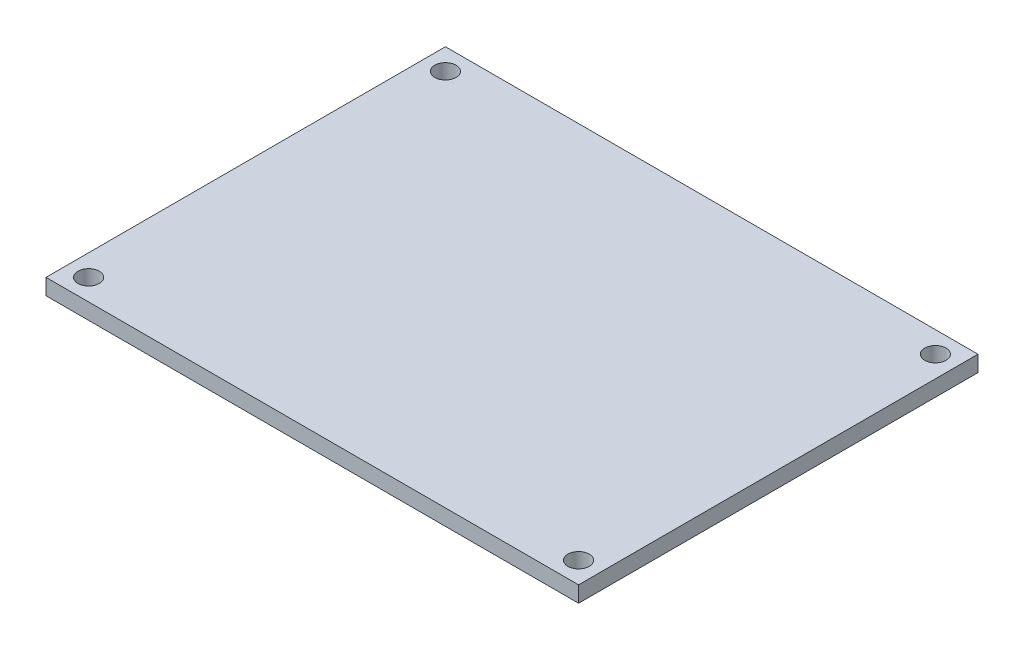
ISO-10303-21;
HEADER;
FILE_DESCRIPTION(('STEP AP214'),'2;1');
FILE_NAME('part.step','',(''),(''),'','','');
FILE_SCHEMA(('AUTOMOTIVE_DESIGN { 1 0 10303 214 1 1 1 1 }'));
ENDSEC;
DATA;
#1=APPLICATION_CONTEXT('core data for automotive mechanical design processes');
#2=APPLICATION_PROTOCOL_DEFINITION('international standard','automotive_design',2000,#1);
#3=PRODUCT_CONTEXT('',#1,'mechanical');
#4=PRODUCT('Part','Part','',(#3));
#5=PRODUCT_RELATED_PRODUCT_CATEGORY('part','',(#4));
#6=PRODUCT_DEFINITION_FORMATION('','',#4);
#7=PRODUCT_DEFINITION_CONTEXT('part definition',#1,'design');
#8=PRODUCT_DEFINITION('design','',#6,#7);
#9=PRODUCT_DEFINITION_SHAPE('','',#8);
#10=(LENGTH_UNIT() NAMED_UNIT(*) SI_UNIT(.MILLI.,.METRE.));
#11=(NAMED_UNIT(*) PLANE_ANGLE_UNIT() SI_UNIT($,.RADIAN.));
#12=(NAMED_UNIT(*) SI_UNIT($,.STERADIAN.) SOLID_ANGLE_UNIT());
#13=UNCERTAINTY_MEASURE_WITH_UNIT(LENGTH_MEASURE(1.E-05),#10,'distance_accuracy_value','');
#14=(GEOMETRIC_REPRESENTATION_CONTEXT(3) GLOBAL_UNCERTAINTY_ASSIGNED_CONTEXT((#13)) GLOBAL_UNIT_ASSIGNED_CONTEXT((#10,
#11,#12)) REPRESENTATION_CONTEXT('',''));
#15=CARTESIAN_POINT('',(0.,0.,0.));
#16=DIRECTION('',(0.,0.,1.));
#17=DIRECTION('',(1.,0.,0.));
#18=AXIS2_PLACEMENT_3D('',#15,#16,#17);
#19=CARTESIAN_POINT('',(0.,3.,0.));
#20=DIRECTION('',(0.,1.,0.));
#21=DIRECTION('',(0.,0.,1.));
#22=AXIS2_PLACEMENT_3D('',#19,#20,#21);
#23=PLANE('',#22);
#24=CARTESIAN_POINT('',(46.,3.,-33.5));
#25=DIRECTION('',(0.,1.,0.));
#26=DIRECTION('',(0.,0.,1.));
#27=AXIS2_PLACEMENT_3D('',#24,#25,#26);
#28=CIRCLE('',#27,2.);
#29=CARTESIAN_POINT('',(46.,3.,-31.5));
#30=VERTEX_POINT('',#29);
#31=EDGE_CURVE('E123',#30,#30,#28,.T.);
#32=ORIENTED_EDGE('',*,*,#31,.F.);
#33=EDGE_LOOP('',(#32));
#34=FACE_BOUND('',#33,.T.);
#35=CARTESIAN_POINT('',(-46.,3.,33.5));
#36=DIRECTION('',(0.,1.,0.));
#37=DIRECTION('',(0.,0.,1.));
#38=AXIS2_PLACEMENT_3D('',#35,#36,#37);
#39=CIRCLE('',#38,2.);
#40=CARTESIAN_POINT('',(-46.,3.,35.5));
#41=VERTEX_POINT('',#40);
#42=EDGE_CURVE('E102',#41,#41,#39,.T.);
#43=ORIENTED_EDGE('',*,*,#42,.F.);
#44=EDGE_LOOP('',(#43));
#45=FACE_BOUND('',#44,.T.);
#46=DIRECTION('',(0.,0.,-1.));
#47=VECTOR('',#46,1.);
#48=CARTESIAN_POINT('',(50.,3.,-37.5));
#49=LINE('',#48,#47);
#50=CARTESIAN_POINT('',(50.,3.,37.5));
#51=VERTEX_POINT('',#50);
#52=CARTESIAN_POINT('',(50.,3.,-37.5));
#53=VERTEX_POINT('',#52);
#54=EDGE_CURVE('E87',#51,#53,#49,.T.);
#55=ORIENTED_EDGE('',*,*,#54,.T.);
#56=DIRECTION('',(-1.,0.,0.));
#57=VECTOR('',#56,1.);
#58=CARTESIAN_POINT('',(-50.,3.,-37.5));
#59=LINE('',#58,#57);
#60=CARTESIAN_POINT('',(-50.,3.,-37.5));
#61=VERTEX_POINT('',#60);
#62=EDGE_CURVE('E82',#53,#61,#59,.T.);
#63=ORIENTED_EDGE('',*,*,#62,.T.);
#64=DIRECTION('',(0.,0.,1.));
#65=VECTOR('',#64,1.);
#66=CARTESIAN_POINT('',(-50.,3.,-37.5));
#67=LINE('',#66,#65);
#68=CARTESIAN_POINT('',(-50.,3.,37.5));
#69=VERTEX_POINT('',#68);
#70=EDGE_CURVE('E85',#61,#69,#67,.T.);
#71=ORIENTED_EDGE('',*,*,#70,.T.);
#72=DIRECTION('',(1.,0.,0.));
#73=VECTOR('',#72,1.);
#74=CARTESIAN_POINT('',(-50.,3.,37.5));
#75=LINE('',#74,#73);
#76=EDGE_CURVE('E52',#69,#51,#75,.T.);
#77=ORIENTED_EDGE('',*,*,#76,.T.);
#78=EDGE_LOOP('',(#55,#63,#71,#77));
#79=FACE_BOUND('',#78,.T.);
#80=CARTESIAN_POINT('',(46.,3.,33.5));
#81=DIRECTION('',(0.,1.,0.));
#82=DIRECTION('',(0.,0.,1.));
#83=AXIS2_PLACEMENT_3D('',#80,#81,#82);
#84=CIRCLE('',#83,2.);
#85=CARTESIAN_POINT('',(46.,3.,35.5));
#86=VERTEX_POINT('',#85);
#87=EDGE_CURVE('E117',#86,#86,#84,.T.);
#88=ORIENTED_EDGE('',*,*,#87,.F.);
#89=EDGE_LOOP('',(#88));
#90=FACE_BOUND('',#89,.T.);
#91=CARTESIAN_POINT('',(-46.,3.,-33.5));
#92=DIRECTION('',(0.,1.,0.));
#93=DIRECTION('',(0.,0.,1.));
#94=AXIS2_PLACEMENT_3D('',#91,#92,#93);
#95=CIRCLE('',#94,2.);
#96=CARTESIAN_POINT('',(-46.,3.,-31.5));
#97=VERTEX_POINT('',#96);
#98=EDGE_CURVE('E129',#97,#97,#95,.T.);
#99=ORIENTED_EDGE('',*,*,#98,.F.);
#100=EDGE_LOOP('',(#99));
#101=FACE_BOUND('',#100,.T.);
#102=ADVANCED_FACE('F35',(#34,#45,#79,#90,#101),#23,.T.);
#103=CARTESIAN_POINT('',(0.,0.,0.));
#104=DIRECTION('',(0.,1.,0.));
#105=DIRECTION('',(0.,0.,1.));
#106=AXIS2_PLACEMENT_3D('',#103,#104,#105);
#107=PLANE('',#106);
#108=DIRECTION('',(0.,0.,-1.));
#109=VECTOR('',#108,1.);
#110=CARTESIAN_POINT('',(50.,0.,-37.5));
#111=LINE('',#110,#109);
#112=CARTESIAN_POINT('',(50.,0.,37.5));
#113=VERTEX_POINT('',#112);
#114=CARTESIAN_POINT('',(50.,0.,-37.5));
#115=VERTEX_POINT('',#114);
#116=EDGE_CURVE('E99',#113,#115,#111,.T.);
#117=ORIENTED_EDGE('',*,*,#116,.F.);
#118=DIRECTION('',(1.,0.,0.));
#119=VECTOR('',#118,1.);
#120=CARTESIAN_POINT('',(-50.,0.,37.5));
#121=LINE('',#120,#119);
#122=CARTESIAN_POINT('',(-50.,0.,37.5));
#123=VERTEX_POINT('',#122);
#124=EDGE_CURVE('E75',#123,#113,#121,.T.);
#125=ORIENTED_EDGE('',*,*,#124,.F.);
#126=DIRECTION('',(0.,0.,1.));
#127=VECTOR('',#126,1.);
#128=CARTESIAN_POINT('',(-50.,0.,-37.5));
#129=LINE('',#128,#127);
#130=CARTESIAN_POINT('',(-50.,0.,-37.5));
#131=VERTEX_POINT('',#130);
#132=EDGE_CURVE('E69',#131,#123,#129,.T.);
#133=ORIENTED_EDGE('',*,*,#132,.F.);
#134=DIRECTION('',(-1.,0.,0.));
#135=VECTOR('',#134,1.);
#136=CARTESIAN_POINT('',(-50.,0.,-37.5));
#137=LINE('',#136,#135);
#138=EDGE_CURVE('E91',#115,#131,#137,.T.);
#139=ORIENTED_EDGE('',*,*,#138,.F.);
#140=EDGE_LOOP('',(#117,#125,#133,#139));
#141=FACE_BOUND('',#140,.T.);
#142=CARTESIAN_POINT('',(-46.,0.,33.5));
#143=DIRECTION('',(0.,1.,0.));
#144=DIRECTION('',(0.,0.,1.));
#145=AXIS2_PLACEMENT_3D('',#142,#143,#144);
#146=CIRCLE('',#145,2.);
#147=CARTESIAN_POINT('',(-46.,0.,35.5));
#148=VERTEX_POINT('',#147);
#149=EDGE_CURVE('E114',#148,#148,#146,.T.);
#150=ORIENTED_EDGE('',*,*,#149,.T.);
#151=EDGE_LOOP('',(#150));
#152=FACE_BOUND('',#151,.T.);
#153=CARTESIAN_POINT('',(46.,0.,33.5));
#154=DIRECTION('',(0.,1.,0.));
#155=DIRECTION('',(0.,0.,1.));
#156=AXIS2_PLACEMENT_3D('',#153,#154,#155);
#157=CIRCLE('',#156,2.);
#158=CARTESIAN_POINT('',(46.,0.,35.5));
#159=VERTEX_POINT('',#158);
#160=EDGE_CURVE('E120',#159,#159,#157,.T.);
#161=ORIENTED_EDGE('',*,*,#160,.T.);
#162=EDGE_LOOP('',(#161));
#163=FACE_BOUND('',#162,.T.);
#164=CARTESIAN_POINT('',(46.,0.,-33.5));
#165=DIRECTION('',(0.,1.,0.));
#166=DIRECTION('',(0.,0.,1.));
#167=AXIS2_PLACEMENT_3D('',#164,#165,#166);
#168=CIRCLE('',#167,2.);
#169=CARTESIAN_POINT('',(46.,0.,-31.5));
#170=VERTEX_POINT('',#169);
#171=EDGE_CURVE('E126',#170,#170,#168,.T.);
#172=ORIENTED_EDGE('',*,*,#171,.T.);
#173=EDGE_LOOP('',(#172));
#174=FACE_BOUND('',#173,.T.);
#175=CARTESIAN_POINT('',(-46.,0.,-33.5));
#176=DIRECTION('',(0.,1.,0.));
#177=DIRECTION('',(0.,0.,1.));
#178=AXIS2_PLACEMENT_3D('',#175,#176,#177);
#179=CIRCLE('',#178,2.);
#180=CARTESIAN_POINT('',(-46.,0.,-31.5));
#181=VERTEX_POINT('',#180);
#182=EDGE_CURVE('E132',#181,#181,#179,.T.);
#183=ORIENTED_EDGE('',*,*,#182,.T.);
#184=EDGE_LOOP('',(#183));
#185=FACE_BOUND('',#184,.T.);
#186=ADVANCED_FACE('F110',(#141,#152,#163,#174,#185),#107,.F.);
#187=CARTESIAN_POINT('',(50.,3.,-37.5));
#188=DIRECTION('',(-1.,0.,0.));
#189=DIRECTION('',(0.,0.,1.));
#190=AXIS2_PLACEMENT_3D('',#187,#188,#189);
#191=PLANE('',#190);
#192=ORIENTED_EDGE('',*,*,#116,.T.);
#193=DIRECTION('',(0.,-1.,0.));
#194=VECTOR('',#193,1.);
#195=CARTESIAN_POINT('',(50.,3.,-37.5));
#196=LINE('',#195,#194);
#197=EDGE_CURVE('E11',#53,#115,#196,.T.);
#198=ORIENTED_EDGE('',*,*,#197,.F.);
#199=ORIENTED_EDGE('',*,*,#54,.F.);
#200=DIRECTION('',(0.,-1.,0.));
#201=VECTOR('',#200,1.);
#202=CARTESIAN_POINT('',(50.,3.,37.5));
#203=LINE('',#202,#201);
#204=EDGE_CURVE('E95',#51,#113,#203,.T.);
#205=ORIENTED_EDGE('',*,*,#204,.T.);
#206=EDGE_LOOP('',(#192,#198,#199,#205));
#207=FACE_BOUND('',#206,.T.);
#208=ADVANCED_FACE('F37',(#207),#191,.F.);
#209=CARTESIAN_POINT('',(-50.,3.,-37.5));
#210=DIRECTION('',(0.,0.,1.));
#211=DIRECTION('',(1.,0.,0.));
#212=AXIS2_PLACEMENT_3D('',#209,#210,#211);
#213=PLANE('',#212);
#214=ORIENTED_EDGE('',*,*,#138,.T.);
#215=DIRECTION('',(0.,-1.,0.));
#216=VECTOR('',#215,1.);
#217=CARTESIAN_POINT('',(-50.,3.,-37.5));
#218=LINE('',#217,#216);
#219=EDGE_CURVE('E44',#61,#131,#218,.T.);
#220=ORIENTED_EDGE('',*,*,#219,.F.);
#221=ORIENTED_EDGE('',*,*,#62,.F.);
#222=ORIENTED_EDGE('',*,*,#197,.T.);
#223=EDGE_LOOP('',(#214,#220,#221,#222));
#224=FACE_BOUND('',#223,.T.);
#225=ADVANCED_FACE('F90',(#224),#213,.F.);
#226=CARTESIAN_POINT('',(-50.,3.,-37.5));
#227=DIRECTION('',(1.,0.,0.));
#228=DIRECTION('',(0.,0.,-1.));
#229=AXIS2_PLACEMENT_3D('',#226,#227,#228);
#230=PLANE('',#229);
#231=ORIENTED_EDGE('',*,*,#132,.T.);
#232=DIRECTION('',(0.,-1.,0.));
#233=VECTOR('',#232,1.);
#234=CARTESIAN_POINT('',(-50.,3.,37.5));
#235=LINE('',#234,#233);
#236=EDGE_CURVE('E92',#69,#123,#235,.T.);
#237=ORIENTED_EDGE('',*,*,#236,.F.);
#238=ORIENTED_EDGE('',*,*,#70,.F.);
#239=ORIENTED_EDGE('',*,*,#219,.T.);
#240=EDGE_LOOP('',(#231,#237,#238,#239));
#241=FACE_BOUND('',#240,.T.);
#242=ADVANCED_FACE('F93',(#241),#230,.F.);
#243=CARTESIAN_POINT('',(-50.,3.,37.5));
#244=DIRECTION('',(0.,0.,-1.));
#245=DIRECTION('',(-1.,0.,0.));
#246=AXIS2_PLACEMENT_3D('',#243,#244,#245);
#247=PLANE('',#246);
#248=ORIENTED_EDGE('',*,*,#124,.T.);
#249=ORIENTED_EDGE('',*,*,#204,.F.);
#250=ORIENTED_EDGE('',*,*,#76,.F.);
#251=ORIENTED_EDGE('',*,*,#236,.T.);
#252=EDGE_LOOP('',(#248,#249,#250,#251));
#253=FACE_BOUND('',#252,.T.);
#254=ADVANCED_FACE('F107',(#253),#247,.F.);
#255=CARTESIAN_POINT('',(-46.,3.,33.5));
#256=DIRECTION('',(0.,-1.,0.));
#257=DIRECTION('',(0.,0.,-1.));
#258=AXIS2_PLACEMENT_3D('',#255,#256,#257);
#259=CYLINDRICAL_SURFACE('',#258,2.);
#260=ORIENTED_EDGE('',*,*,#42,.T.);
#261=EDGE_LOOP('',(#260));
#262=FACE_BOUND('',#261,.T.);
#263=ORIENTED_EDGE('',*,*,#149,.F.);
#264=EDGE_LOOP('',(#263));
#265=FACE_BOUND('',#264,.T.);
#266=ADVANCED_FACE('F151',(#262,#265),#259,.F.);
#267=CARTESIAN_POINT('',(46.,3.,33.5));
#268=DIRECTION('',(0.,-1.,0.));
#269=DIRECTION('',(0.,0.,-1.));
#270=AXIS2_PLACEMENT_3D('',#267,#268,#269);
#271=CYLINDRICAL_SURFACE('',#270,2.);
#272=ORIENTED_EDGE('',*,*,#87,.T.);
#273=EDGE_LOOP('',(#272));
#274=FACE_BOUND('',#273,.T.);
#275=ORIENTED_EDGE('',*,*,#160,.F.);
#276=EDGE_LOOP('',(#275));
#277=FACE_BOUND('',#276,.T.);
#278=ADVANCED_FACE('F197',(#274,#277),#271,.F.);
#279=CARTESIAN_POINT('',(46.,3.,-33.5));
#280=DIRECTION('',(0.,-1.,0.));
#281=DIRECTION('',(0.,0.,-1.));
#282=AXIS2_PLACEMENT_3D('',#279,#280,#281);
#283=CYLINDRICAL_SURFACE('',#282,2.);
#284=ORIENTED_EDGE('',*,*,#31,.T.);
#285=EDGE_LOOP('',(#284));
#286=FACE_BOUND('',#285,.T.);
#287=ORIENTED_EDGE('',*,*,#171,.F.);
#288=EDGE_LOOP('',(#287));
#289=FACE_BOUND('',#288,.T.);
#290=ADVANCED_FACE('F205',(#286,#289),#283,.F.);
#291=CARTESIAN_POINT('',(-46.,3.,-33.5));
#292=DIRECTION('',(0.,-1.,0.));
#293=DIRECTION('',(0.,0.,-1.));
#294=AXIS2_PLACEMENT_3D('',#291,#292,#293);
#295=CYLINDRICAL_SURFACE('',#294,2.);
#296=ORIENTED_EDGE('',*,*,#98,.T.);
#297=EDGE_LOOP('',(#296));
#298=FACE_BOUND('',#297,.T.);
#299=ORIENTED_EDGE('',*,*,#182,.F.);
#300=EDGE_LOOP('',(#299));
#301=FACE_BOUND('',#300,.T.);
#302=ADVANCED_FACE('F138',(#298,#301),#295,.F.);
#303=CLOSED_SHELL('',(#102,#186,#208,#225,#242,#254,#266,#278,#290,#302));
#304=MANIFOLD_SOLID_BREP('B2',#303);
#305=ADVANCED_BREP_SHAPE_REPRESENTATION('',(#18,#304),#14);
#306=SHAPE_DEFINITION_REPRESENTATION(#9,#305);
ENDSEC;
END-ISO-10303-21;
